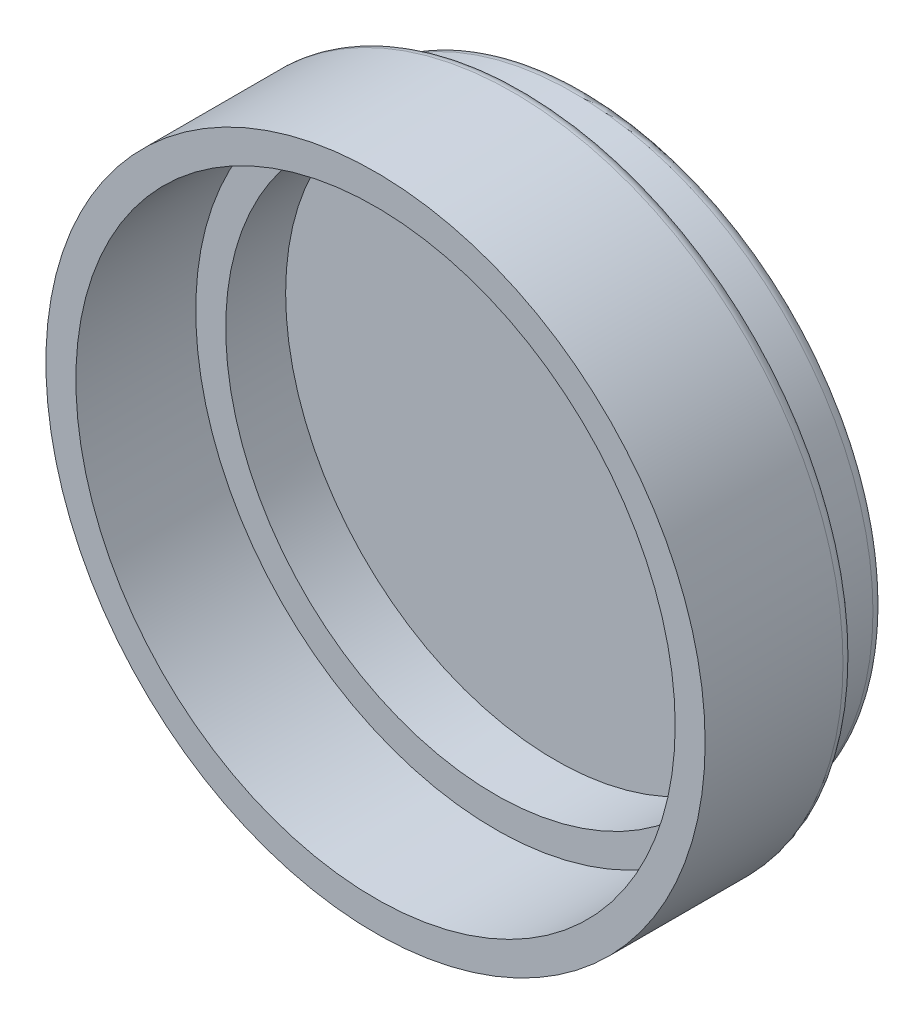
ISO-10303-21;
HEADER;
FILE_DESCRIPTION(('STEP AP214'),'2;1');
FILE_NAME('part.step','',(''),(''),'','','');
FILE_SCHEMA(('AUTOMOTIVE_DESIGN { 1 0 10303 214 1 1 1 1 }'));
ENDSEC;
DATA;
#1=APPLICATION_CONTEXT('core data for automotive mechanical design processes');
#2=APPLICATION_PROTOCOL_DEFINITION('international standard','automotive_design',2000,#1);
#3=PRODUCT_CONTEXT('',#1,'mechanical');
#4=PRODUCT('Part','Part','',(#3));
#5=PRODUCT_RELATED_PRODUCT_CATEGORY('part','',(#4));
#6=PRODUCT_DEFINITION_FORMATION('','',#4);
#7=PRODUCT_DEFINITION_CONTEXT('part definition',#1,'design');
#8=PRODUCT_DEFINITION('design','',#6,#7);
#9=PRODUCT_DEFINITION_SHAPE('','',#8);
#10=(LENGTH_UNIT() NAMED_UNIT(*) SI_UNIT(.MILLI.,.METRE.));
#11=(NAMED_UNIT(*) PLANE_ANGLE_UNIT() SI_UNIT($,.RADIAN.));
#12=(NAMED_UNIT(*) SI_UNIT($,.STERADIAN.) SOLID_ANGLE_UNIT());
#13=UNCERTAINTY_MEASURE_WITH_UNIT(LENGTH_MEASURE(1.E-05),#10,'distance_accuracy_value','');
#14=(GEOMETRIC_REPRESENTATION_CONTEXT(3) GLOBAL_UNCERTAINTY_ASSIGNED_CONTEXT((#13)) GLOBAL_UNIT_ASSIGNED_CONTEXT((#10,
#11,#12)) REPRESENTATION_CONTEXT('',''));
#15=CARTESIAN_POINT('',(0.,0.,0.));
#16=DIRECTION('',(0.,0.,1.));
#17=DIRECTION('',(1.,0.,0.));
#18=AXIS2_PLACEMENT_3D('',#15,#16,#17);
#19=CARTESIAN_POINT('',(0.,0.,25.));
#20=DIRECTION('',(0.,0.,-1.));
#21=DIRECTION('',(-1.00000000000001,0.,0.));
#22=AXIS2_PLACEMENT_3D('',#19,#20,#21);
#23=CYLINDRICAL_SURFACE('',#22,55.);
#24=CARTESIAN_POINT('',(0.,0.,2.));
#25=DIRECTION('',(0.,0.,1.));
#26=DIRECTION('',(1.00000000000001,0.,0.));
#27=AXIS2_PLACEMENT_3D('',#24,#25,#26);
#28=CIRCLE('',#27,55.);
#29=CARTESIAN_POINT('',(55.0000000000003,0.,2.));
#30=VERTEX_POINT('',#29);
#31=EDGE_CURVE('E51',#30,#30,#28,.T.);
#32=ORIENTED_EDGE('',*,*,#31,.T.);
#33=EDGE_LOOP('',(#32));
#34=FACE_BOUND('',#33,.T.);
#35=CARTESIAN_POINT('',(0.,0.,25.));
#36=DIRECTION('',(0.,0.,1.));
#37=DIRECTION('',(1.00000000000001,0.,0.));
#38=AXIS2_PLACEMENT_3D('',#35,#36,#37);
#39=CIRCLE('',#38,55.);
#40=CARTESIAN_POINT('',(55.0000000000003,0.,25.));
#41=VERTEX_POINT('',#40);
#42=EDGE_CURVE('E70',#41,#41,#39,.T.);
#43=ORIENTED_EDGE('',*,*,#42,.F.);
#44=EDGE_LOOP('',(#43));
#45=FACE_BOUND('',#44,.T.);
#46=ADVANCED_FACE('F44',(#34,#45),#23,.T.);
#47=CARTESIAN_POINT('',(0.,0.,25.));
#48=DIRECTION('',(0.,0.,1.));
#49=DIRECTION('',(1.00000000000001,0.,0.));
#50=AXIS2_PLACEMENT_3D('',#47,#48,#49);
#51=PLANE('',#50);
#52=CARTESIAN_POINT('',(0.,0.,25.));
#53=DIRECTION('',(0.,0.,1.));
#54=DIRECTION('',(1.00000000000001,0.,0.));
#55=AXIS2_PLACEMENT_3D('',#52,#53,#54);
#56=CIRCLE('',#55,50.);
#57=CARTESIAN_POINT('',(50.0000000000003,0.,25.));
#58=VERTEX_POINT('',#57);
#59=EDGE_CURVE('E74',#58,#58,#56,.T.);
#60=ORIENTED_EDGE('',*,*,#59,.F.);
#61=EDGE_LOOP('',(#60));
#62=FACE_BOUND('',#61,.T.);
#63=ORIENTED_EDGE('',*,*,#42,.T.);
#64=EDGE_LOOP('',(#63));
#65=FACE_BOUND('',#64,.T.);
#66=ADVANCED_FACE('F104',(#62,#65),#51,.T.);
#67=CARTESIAN_POINT('',(0.,0.,0.));
#68=DIRECTION('',(0.,0.,1.));
#69=DIRECTION('',(1.00000000000001,0.,0.));
#70=AXIS2_PLACEMENT_3D('',#67,#68,#69);
#71=PLANE('',#70);
#72=CARTESIAN_POINT('',(0.,0.,0.));
#73=DIRECTION('',(0.,0.,1.));
#74=DIRECTION('',(1.00000000000001,0.,0.));
#75=AXIS2_PLACEMENT_3D('',#72,#73,#74);
#76=CIRCLE('',#75,53.);
#77=CARTESIAN_POINT('',(53.0000000000003,0.,0.));
#78=VERTEX_POINT('',#77);
#79=EDGE_CURVE('E12',#78,#78,#76,.F.);
#80=ORIENTED_EDGE('',*,*,#79,.T.);
#81=EDGE_LOOP('',(#80));
#82=FACE_BOUND('',#81,.T.);
#83=CARTESIAN_POINT('',(0.,0.,0.));
#84=DIRECTION('',(0.,0.,1.));
#85=DIRECTION('',(1.00000000000001,0.,0.));
#86=AXIS2_PLACEMENT_3D('',#83,#84,#85);
#87=CIRCLE('',#86,52.);
#88=CARTESIAN_POINT('',(52.0000000000003,0.,0.));
#89=VERTEX_POINT('',#88);
#90=EDGE_CURVE('E59',#89,#89,#87,.T.);
#91=ORIENTED_EDGE('',*,*,#90,.T.);
#92=EDGE_LOOP('',(#91));
#93=FACE_BOUND('',#92,.T.);
#94=ADVANCED_FACE('F109',(#82,#93),#71,.F.);
#95=CARTESIAN_POINT('',(0.,0.,-10.));
#96=DIRECTION('',(0.,0.,1.));
#97=DIRECTION('',(1.00000000000001,0.,0.));
#98=AXIS2_PLACEMENT_3D('',#95,#96,#97);
#99=CYLINDRICAL_SURFACE('',#98,50.);
#100=CARTESIAN_POINT('',(0.,0.,-2.));
#101=DIRECTION('',(0.,0.,1.));
#102=DIRECTION('',(1.00000000000001,0.,0.));
#103=AXIS2_PLACEMENT_3D('',#100,#101,#102);
#104=CIRCLE('',#103,50.);
#105=CARTESIAN_POINT('',(50.0000000000003,0.,-2.));
#106=VERTEX_POINT('',#105);
#107=EDGE_CURVE('E64',#106,#106,#104,.F.);
#108=ORIENTED_EDGE('',*,*,#107,.T.);
#109=EDGE_LOOP('',(#108));
#110=FACE_BOUND('',#109,.T.);
#111=CARTESIAN_POINT('',(0.,0.,-8.00000000000001));
#112=DIRECTION('',(0.,0.,-1.));
#113=DIRECTION('',(-1.00000000000001,0.,0.));
#114=AXIS2_PLACEMENT_3D('',#111,#112,#113);
#115=CIRCLE('',#114,50.);
#116=CARTESIAN_POINT('',(-50.0000000000003,0.,-8.00000000000001));
#117=VERTEX_POINT('',#116);
#118=EDGE_CURVE('E67',#117,#117,#115,.F.);
#119=ORIENTED_EDGE('',*,*,#118,.T.);
#120=EDGE_LOOP('',(#119));
#121=FACE_BOUND('',#120,.T.);
#122=ADVANCED_FACE('F100',(#110,#121),#99,.T.);
#123=CARTESIAN_POINT('',(0.,0.,-10.));
#124=DIRECTION('',(0.,0.,-1.));
#125=DIRECTION('',(-1.00000000000001,0.,0.));
#126=AXIS2_PLACEMENT_3D('',#123,#124,#125);
#127=PLANE('',#126);
#128=CARTESIAN_POINT('',(0.,0.,-10.));
#129=DIRECTION('',(0.,0.,-1.));
#130=DIRECTION('',(-1.00000000000001,0.,0.));
#131=AXIS2_PLACEMENT_3D('',#128,#129,#130);
#132=CIRCLE('',#131,48.);
#133=CARTESIAN_POINT('',(-48.0000000000003,0.,-10.));
#134=VERTEX_POINT('',#133);
#135=EDGE_CURVE('E55',#134,#134,#132,.T.);
#136=ORIENTED_EDGE('',*,*,#135,.T.);
#137=EDGE_LOOP('',(#136));
#138=FACE_BOUND('',#137,.T.);
#139=ADVANCED_FACE('F90',(#138),#127,.T.);
#140=CARTESIAN_POINT('',(0.,0.,25.));
#141=DIRECTION('',(0.,0.,-1.));
#142=DIRECTION('',(-1.00000000000001,0.,0.));
#143=AXIS2_PLACEMENT_3D('',#140,#141,#142);
#144=CYLINDRICAL_SURFACE('',#143,50.);
#145=ORIENTED_EDGE('',*,*,#59,.T.);
#146=EDGE_LOOP('',(#145));
#147=FACE_BOUND('',#146,.T.);
#148=CARTESIAN_POINT('',(0.,0.,5.));
#149=DIRECTION('',(0.,0.,1.));
#150=DIRECTION('',(1.00000000000001,0.,0.));
#151=AXIS2_PLACEMENT_3D('',#148,#149,#150);
#152=CIRCLE('',#151,50.);
#153=CARTESIAN_POINT('',(50.0000000000003,0.,5.));
#154=VERTEX_POINT('',#153);
#155=EDGE_CURVE('E77',#154,#154,#152,.T.);
#156=ORIENTED_EDGE('',*,*,#155,.F.);
#157=EDGE_LOOP('',(#156));
#158=FACE_BOUND('',#157,.T.);
#159=ADVANCED_FACE('F88',(#147,#158),#144,.F.);
#160=CARTESIAN_POINT('',(0.,0.,5.));
#161=DIRECTION('',(0.,0.,1.));
#162=DIRECTION('',(1.00000000000001,0.,0.));
#163=AXIS2_PLACEMENT_3D('',#160,#161,#162);
#164=PLANE('',#163);
#165=CARTESIAN_POINT('',(0.,0.,5.));
#166=DIRECTION('',(0.,0.,1.));
#167=DIRECTION('',(1.00000000000001,0.,0.));
#168=AXIS2_PLACEMENT_3D('',#165,#166,#167);
#169=CIRCLE('',#168,45.);
#170=CARTESIAN_POINT('',(45.0000000000003,0.,5.));
#171=VERTEX_POINT('',#170);
#172=EDGE_CURVE('E73',#171,#171,#169,.F.);
#173=ORIENTED_EDGE('',*,*,#172,.T.);
#174=EDGE_LOOP('',(#173));
#175=FACE_BOUND('',#174,.T.);
#176=ORIENTED_EDGE('',*,*,#155,.T.);
#177=EDGE_LOOP('',(#176));
#178=FACE_BOUND('',#177,.T.);
#179=ADVANCED_FACE('F86',(#175,#178),#164,.T.);
#180=CARTESIAN_POINT('',(0.,0.,-10.));
#181=DIRECTION('',(0.,0.,1.));
#182=DIRECTION('',(1.00000000000001,0.,0.));
#183=AXIS2_PLACEMENT_3D('',#180,#181,#182);
#184=CYLINDRICAL_SURFACE('',#183,45.);
#185=CARTESIAN_POINT('',(0.,0.,-5.));
#186=DIRECTION('',(0.,0.,-1.));
#187=DIRECTION('',(-1.00000000000001,0.,0.));
#188=AXIS2_PLACEMENT_3D('',#185,#186,#187);
#189=CIRCLE('',#188,45.);
#190=CARTESIAN_POINT('',(-45.0000000000003,0.,-5.));
#191=VERTEX_POINT('',#190);
#192=EDGE_CURVE('E78',#191,#191,#189,.T.);
#193=ORIENTED_EDGE('',*,*,#192,.T.);
#194=EDGE_LOOP('',(#193));
#195=FACE_BOUND('',#194,.T.);
#196=ORIENTED_EDGE('',*,*,#172,.F.);
#197=EDGE_LOOP('',(#196));
#198=FACE_BOUND('',#197,.T.);
#199=ADVANCED_FACE('F97',(#195,#198),#184,.F.);
#200=CARTESIAN_POINT('',(0.,0.,-5.));
#201=DIRECTION('',(0.,0.,-1.));
#202=DIRECTION('',(-1.00000000000001,0.,0.));
#203=AXIS2_PLACEMENT_3D('',#200,#201,#202);
#204=PLANE('',#203);
#205=ORIENTED_EDGE('',*,*,#192,.F.);
#206=EDGE_LOOP('',(#205));
#207=FACE_BOUND('',#206,.T.);
#208=ADVANCED_FACE('F118',(#207),#204,.F.);
#209=CARTESIAN_POINT('',(0.,0.,-2.));
#210=DIRECTION('',(0.,0.,1.));
#211=DIRECTION('',(1.00000000000001,0.,0.));
#212=AXIS2_PLACEMENT_3D('',#209,#210,#211);
#213=TOROIDAL_SURFACE('',#212,52.,2.);
#214=ORIENTED_EDGE('',*,*,#90,.F.);
#215=EDGE_LOOP('',(#214));
#216=FACE_BOUND('',#215,.T.);
#217=ORIENTED_EDGE('',*,*,#107,.F.);
#218=EDGE_LOOP('',(#217));
#219=FACE_BOUND('',#218,.T.);
#220=ADVANCED_FACE('F115',(#216,#219),#213,.F.);
#221=CARTESIAN_POINT('',(0.,0.,-8.00000000000001));
#222=DIRECTION('',(0.,0.,-1.));
#223=DIRECTION('',(-1.00000000000001,0.,0.));
#224=AXIS2_PLACEMENT_3D('',#221,#222,#223);
#225=TOROIDAL_SURFACE('',#224,48.,2.);
#226=ORIENTED_EDGE('',*,*,#118,.F.);
#227=EDGE_LOOP('',(#226));
#228=FACE_BOUND('',#227,.T.);
#229=ORIENTED_EDGE('',*,*,#135,.F.);
#230=EDGE_LOOP('',(#229));
#231=FACE_BOUND('',#230,.T.);
#232=ADVANCED_FACE('F117',(#228,#231),#225,.T.);
#233=CARTESIAN_POINT('',(0.,0.,2.));
#234=DIRECTION('',(0.,0.,1.));
#235=DIRECTION('',(1.00000000000001,0.,0.));
#236=AXIS2_PLACEMENT_3D('',#233,#234,#235);
#237=TOROIDAL_SURFACE('',#236,53.,2.);
#238=ORIENTED_EDGE('',*,*,#79,.F.);
#239=EDGE_LOOP('',(#238));
#240=FACE_BOUND('',#239,.T.);
#241=ORIENTED_EDGE('',*,*,#31,.F.);
#242=EDGE_LOOP('',(#241));
#243=FACE_BOUND('',#242,.T.);
#244=ADVANCED_FACE('F46',(#240,#243),#237,.T.);
#245=CLOSED_SHELL('',(#46,#66,#94,#122,#139,#159,#179,#199,#208,#220,#232,#244));
#246=MANIFOLD_SOLID_BREP('B2',#245);
#247=ADVANCED_BREP_SHAPE_REPRESENTATION('',(#18,#246),#14);
#248=SHAPE_DEFINITION_REPRESENTATION(#9,#247);
ENDSEC;
END-ISO-10303-21;
